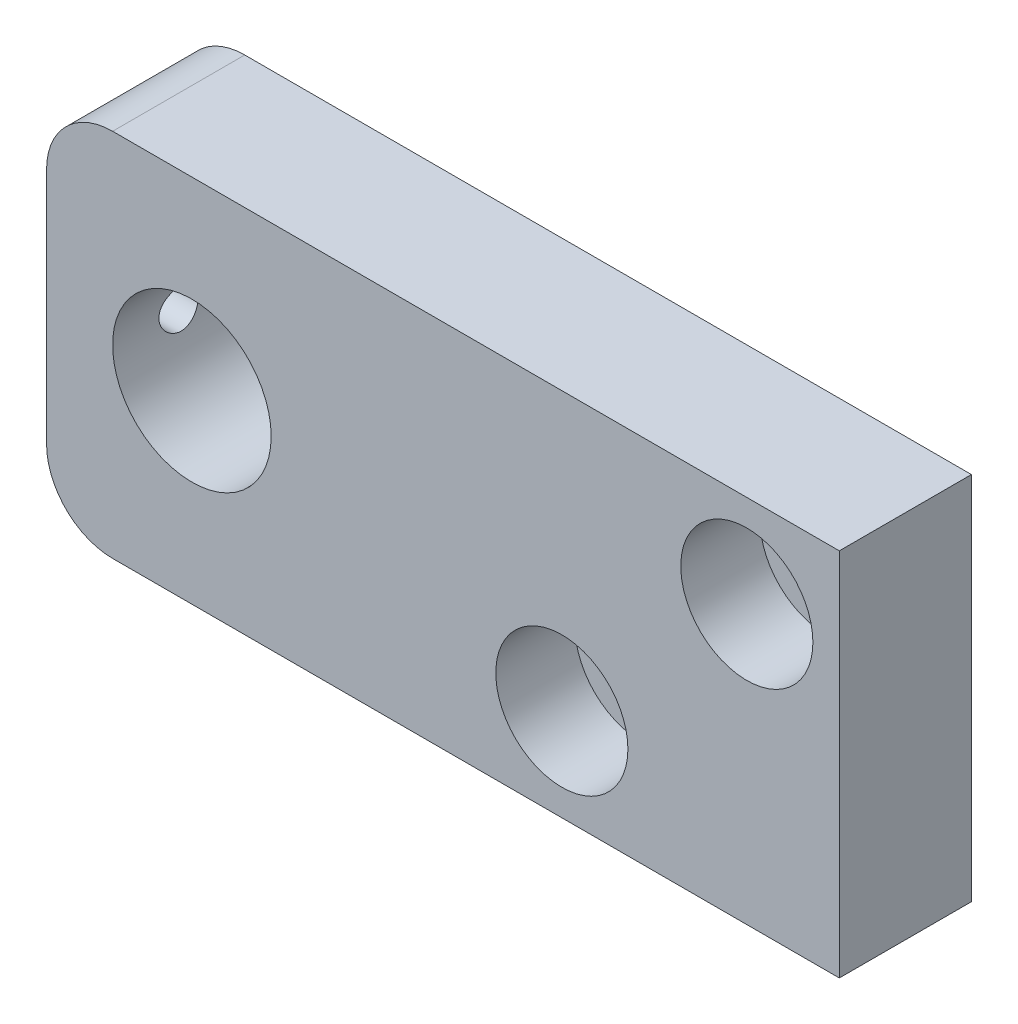
ISO-10303-21;
HEADER;
FILE_DESCRIPTION(('STEP AP214'),'2;1');
FILE_NAME('part.step','',(''),(''),'','','');
FILE_SCHEMA(('AUTOMOTIVE_DESIGN { 1 0 10303 214 1 1 1 1 }'));
ENDSEC;
DATA;
#1=APPLICATION_CONTEXT('core data for automotive mechanical design processes');
#2=APPLICATION_PROTOCOL_DEFINITION('international standard','automotive_design',2000,#1);
#3=PRODUCT_CONTEXT('',#1,'mechanical');
#4=PRODUCT('Part','Part','',(#3));
#5=PRODUCT_RELATED_PRODUCT_CATEGORY('part','',(#4));
#6=PRODUCT_DEFINITION_FORMATION('','',#4);
#7=PRODUCT_DEFINITION_CONTEXT('part definition',#1,'design');
#8=PRODUCT_DEFINITION('design','',#6,#7);
#9=PRODUCT_DEFINITION_SHAPE('','',#8);
#10=(LENGTH_UNIT() NAMED_UNIT(*) SI_UNIT(.MILLI.,.METRE.));
#11=(NAMED_UNIT(*) PLANE_ANGLE_UNIT() SI_UNIT($,.RADIAN.));
#12=(NAMED_UNIT(*) SI_UNIT($,.STERADIAN.) SOLID_ANGLE_UNIT());
#13=UNCERTAINTY_MEASURE_WITH_UNIT(LENGTH_MEASURE(1.E-05),#10,'distance_accuracy_value','');
#14=(GEOMETRIC_REPRESENTATION_CONTEXT(3) GLOBAL_UNCERTAINTY_ASSIGNED_CONTEXT((#13)) GLOBAL_UNIT_ASSIGNED_CONTEXT((#10,
#11,#12)) REPRESENTATION_CONTEXT('',''));
#15=CARTESIAN_POINT('',(0.,0.,0.));
#16=DIRECTION('',(0.,0.,1.));
#17=DIRECTION('',(1.,0.,0.));
#18=AXIS2_PLACEMENT_3D('',#15,#16,#17);
#19=CARTESIAN_POINT('',(23.,7.,10.));
#20=DIRECTION('',(0.,0.,-1.));
#21=DIRECTION('',(-1.,0.,0.));
#22=AXIS2_PLACEMENT_3D('',#19,#20,#21);
#23=CYLINDRICAL_SURFACE('',#22,3.);
#24=CARTESIAN_POINT('',(23.,7.,0.));
#25=DIRECTION('',(0.,0.,1.));
#26=DIRECTION('',(1.,0.,0.));
#27=AXIS2_PLACEMENT_3D('',#24,#25,#26);
#28=CIRCLE('',#27,3.);
#29=CARTESIAN_POINT('',(26.,7.,0.));
#30=VERTEX_POINT('',#29);
#31=EDGE_CURVE('E124',#30,#30,#28,.T.);
#32=ORIENTED_EDGE('',*,*,#31,.F.);
#33=EDGE_LOOP('',(#32));
#34=FACE_BOUND('',#33,.T.);
#35=CARTESIAN_POINT('',(23.,7.,4.));
#36=DIRECTION('',(0.,0.,1.));
#37=DIRECTION('',(1.,0.,0.));
#38=AXIS2_PLACEMENT_3D('',#35,#36,#37);
#39=CIRCLE('',#38,3.);
#40=CARTESIAN_POINT('',(26.,7.,4.));
#41=VERTEX_POINT('',#40);
#42=EDGE_CURVE('E37',#41,#41,#39,.T.);
#43=ORIENTED_EDGE('',*,*,#42,.T.);
#44=EDGE_LOOP('',(#43));
#45=FACE_BOUND('',#44,.T.);
#46=ADVANCED_FACE('F33',(#34,#45),#23,.F.);
#47=CARTESIAN_POINT('',(9.00000000000001,-7.,10.));
#48=DIRECTION('',(0.,0.,-1.));
#49=DIRECTION('',(-1.,0.,0.));
#50=AXIS2_PLACEMENT_3D('',#47,#48,#49);
#51=CYLINDRICAL_SURFACE('',#50,3.);
#52=CARTESIAN_POINT('',(9.00000000000001,-7.,0.));
#53=DIRECTION('',(0.,0.,1.));
#54=DIRECTION('',(1.,0.,0.));
#55=AXIS2_PLACEMENT_3D('',#52,#53,#54);
#56=CIRCLE('',#55,3.);
#57=CARTESIAN_POINT('',(12.,-7.,0.));
#58=VERTEX_POINT('',#57);
#59=EDGE_CURVE('E160',#58,#58,#56,.T.);
#60=ORIENTED_EDGE('',*,*,#59,.F.);
#61=EDGE_LOOP('',(#60));
#62=FACE_BOUND('',#61,.T.);
#63=CARTESIAN_POINT('',(9.00000000000001,-7.,4.));
#64=DIRECTION('',(0.,0.,1.));
#65=DIRECTION('',(1.,0.,0.));
#66=AXIS2_PLACEMENT_3D('',#63,#64,#65);
#67=CIRCLE('',#66,3.);
#68=CARTESIAN_POINT('',(12.,-7.,4.));
#69=VERTEX_POINT('',#68);
#70=EDGE_CURVE('E136',#69,#69,#67,.T.);
#71=ORIENTED_EDGE('',*,*,#70,.T.);
#72=EDGE_LOOP('',(#71));
#73=FACE_BOUND('',#72,.T.);
#74=ADVANCED_FACE('F191',(#62,#73),#51,.F.);
#75=CARTESIAN_POINT('',(-25.,9.,10.));
#76=DIRECTION('',(0.,0.,1.));
#77=DIRECTION('',(1.,0.,0.));
#78=AXIS2_PLACEMENT_3D('',#75,#76,#77);
#79=PLANE('',#78);
#80=CARTESIAN_POINT('',(9.00000000000001,-7.,10.));
#81=DIRECTION('',(0.,0.,1.));
#82=DIRECTION('',(1.,0.,0.));
#83=AXIS2_PLACEMENT_3D('',#80,#81,#82);
#84=CIRCLE('',#83,5.);
#85=CARTESIAN_POINT('',(14.,-7.,10.));
#86=VERTEX_POINT('',#85);
#87=EDGE_CURVE('E144',#86,#86,#84,.T.);
#88=ORIENTED_EDGE('',*,*,#87,.F.);
#89=EDGE_LOOP('',(#88));
#90=FACE_BOUND('',#89,.T.);
#91=CARTESIAN_POINT('',(23.,7.,10.));
#92=DIRECTION('',(0.,0.,1.));
#93=DIRECTION('',(1.,0.,0.));
#94=AXIS2_PLACEMENT_3D('',#91,#92,#93);
#95=CIRCLE('',#94,5.);
#96=CARTESIAN_POINT('',(28.,7.,10.));
#97=VERTEX_POINT('',#96);
#98=EDGE_CURVE('E154',#97,#97,#95,.T.);
#99=ORIENTED_EDGE('',*,*,#98,.F.);
#100=EDGE_LOOP('',(#99));
#101=FACE_BOUND('',#100,.T.);
#102=CARTESIAN_POINT('',(-19.,0.,10.));
#103=DIRECTION('',(0.,0.,1.));
#104=DIRECTION('',(1.,0.,0.));
#105=AXIS2_PLACEMENT_3D('',#102,#103,#104);
#106=CIRCLE('',#105,6.);
#107=CARTESIAN_POINT('',(-13.,0.,10.));
#108=VERTEX_POINT('',#107);
#109=EDGE_CURVE('E238',#108,#108,#106,.T.);
#110=ORIENTED_EDGE('',*,*,#109,.F.);
#111=EDGE_LOOP('',(#110));
#112=FACE_BOUND('',#111,.T.);
#113=DIRECTION('',(0.,1.,0.));
#114=VECTOR('',#113,1.);
#115=CARTESIAN_POINT('',(30.,-14.,10.));
#116=LINE('',#115,#114);
#117=CARTESIAN_POINT('',(30.,-14.,10.));
#118=VERTEX_POINT('',#117);
#119=CARTESIAN_POINT('',(30.,14.,10.));
#120=VERTEX_POINT('',#119);
#121=EDGE_CURVE('E131',#118,#120,#116,.T.);
#122=ORIENTED_EDGE('',*,*,#121,.T.);
#123=DIRECTION('',(-1.,0.,0.));
#124=VECTOR('',#123,1.);
#125=CARTESIAN_POINT('',(30.,14.,10.));
#126=LINE('',#125,#124);
#127=CARTESIAN_POINT('',(-25.,14.,10.));
#128=VERTEX_POINT('',#127);
#129=EDGE_CURVE('E89',#120,#128,#126,.T.);
#130=ORIENTED_EDGE('',*,*,#129,.T.);
#131=CARTESIAN_POINT('',(-25.,9.,10.));
#132=DIRECTION('',(0.,0.,1.));
#133=DIRECTION('',(1.,0.,0.));
#134=AXIS2_PLACEMENT_3D('',#131,#132,#133);
#135=CIRCLE('',#134,5.);
#136=CARTESIAN_POINT('',(-30.,9.,10.));
#137=VERTEX_POINT('',#136);
#138=EDGE_CURVE('E102',#128,#137,#135,.T.);
#139=ORIENTED_EDGE('',*,*,#138,.T.);
#140=DIRECTION('',(0.,-1.,0.));
#141=VECTOR('',#140,1.);
#142=CARTESIAN_POINT('',(-30.,-9.00000000000001,10.));
#143=LINE('',#142,#141);
#144=CARTESIAN_POINT('',(-30.,-9.00000000000001,10.));
#145=VERTEX_POINT('',#144);
#146=EDGE_CURVE('E96',#137,#145,#143,.T.);
#147=ORIENTED_EDGE('',*,*,#146,.T.);
#148=CARTESIAN_POINT('',(-25.,-9.00000000000001,10.));
#149=DIRECTION('',(0.,0.,1.));
#150=DIRECTION('',(-1.,0.,0.));
#151=AXIS2_PLACEMENT_3D('',#148,#149,#150);
#152=CIRCLE('',#151,5.);
#153=CARTESIAN_POINT('',(-25.,-14.,10.));
#154=VERTEX_POINT('',#153);
#155=EDGE_CURVE('E100',#145,#154,#152,.T.);
#156=ORIENTED_EDGE('',*,*,#155,.T.);
#157=DIRECTION('',(1.,0.,0.));
#158=VECTOR('',#157,1.);
#159=CARTESIAN_POINT('',(30.,-14.,10.));
#160=LINE('',#159,#158);
#161=EDGE_CURVE('E52',#154,#118,#160,.T.);
#162=ORIENTED_EDGE('',*,*,#161,.T.);
#163=EDGE_LOOP('',(#122,#130,#139,#147,#156,#162));
#164=FACE_BOUND('',#163,.T.);
#165=ADVANCED_FACE('F98',(#90,#101,#112,#164),#79,.T.);
#166=CARTESIAN_POINT('',(-25.,9.,0.));
#167=DIRECTION('',(0.,0.,1.));
#168=DIRECTION('',(1.,0.,0.));
#169=AXIS2_PLACEMENT_3D('',#166,#167,#168);
#170=PLANE('',#169);
#171=DIRECTION('',(0.,1.,0.));
#172=VECTOR('',#171,1.);
#173=CARTESIAN_POINT('',(30.,-14.,0.));
#174=LINE('',#173,#172);
#175=CARTESIAN_POINT('',(30.,-14.,0.));
#176=VERTEX_POINT('',#175);
#177=CARTESIAN_POINT('',(30.,14.,0.));
#178=VERTEX_POINT('',#177);
#179=EDGE_CURVE('E120',#176,#178,#174,.T.);
#180=ORIENTED_EDGE('',*,*,#179,.F.);
#181=DIRECTION('',(1.,0.,0.));
#182=VECTOR('',#181,1.);
#183=CARTESIAN_POINT('',(30.,-14.,0.));
#184=LINE('',#183,#182);
#185=CARTESIAN_POINT('',(-25.,-14.,0.));
#186=VERTEX_POINT('',#185);
#187=EDGE_CURVE('E81',#186,#176,#184,.T.);
#188=ORIENTED_EDGE('',*,*,#187,.F.);
#189=CARTESIAN_POINT('',(-25.,-9.00000000000001,0.));
#190=DIRECTION('',(0.,0.,1.));
#191=DIRECTION('',(-1.,0.,0.));
#192=AXIS2_PLACEMENT_3D('',#189,#190,#191);
#193=CIRCLE('',#192,5.);
#194=CARTESIAN_POINT('',(-30.,-9.00000000000001,0.));
#195=VERTEX_POINT('',#194);
#196=EDGE_CURVE('E75',#195,#186,#193,.T.);
#197=ORIENTED_EDGE('',*,*,#196,.F.);
#198=DIRECTION('',(0.,-1.,0.));
#199=VECTOR('',#198,1.);
#200=CARTESIAN_POINT('',(-30.,-9.00000000000001,0.));
#201=LINE('',#200,#199);
#202=CARTESIAN_POINT('',(-30.,9.,0.));
#203=VERTEX_POINT('',#202);
#204=EDGE_CURVE('E110',#203,#195,#201,.T.);
#205=ORIENTED_EDGE('',*,*,#204,.F.);
#206=CARTESIAN_POINT('',(-25.,9.,0.));
#207=DIRECTION('',(0.,0.,1.));
#208=DIRECTION('',(1.,0.,0.));
#209=AXIS2_PLACEMENT_3D('',#206,#207,#208);
#210=CIRCLE('',#209,5.);
#211=CARTESIAN_POINT('',(-25.,14.,0.));
#212=VERTEX_POINT('',#211);
#213=EDGE_CURVE('E126',#212,#203,#210,.T.);
#214=ORIENTED_EDGE('',*,*,#213,.F.);
#215=DIRECTION('',(-1.,0.,0.));
#216=VECTOR('',#215,1.);
#217=CARTESIAN_POINT('',(30.,14.,0.));
#218=LINE('',#217,#216);
#219=EDGE_CURVE('E123',#178,#212,#218,.T.);
#220=ORIENTED_EDGE('',*,*,#219,.F.);
#221=EDGE_LOOP('',(#180,#188,#197,#205,#214,#220));
#222=FACE_BOUND('',#221,.T.);
#223=ORIENTED_EDGE('',*,*,#31,.T.);
#224=EDGE_LOOP('',(#223));
#225=FACE_BOUND('',#224,.T.);
#226=CARTESIAN_POINT('',(-19.,0.,0.));
#227=DIRECTION('',(0.,0.,1.));
#228=DIRECTION('',(1.,0.,0.));
#229=AXIS2_PLACEMENT_3D('',#226,#227,#228);
#230=CIRCLE('',#229,6.);
#231=CARTESIAN_POINT('',(-13.,0.,0.));
#232=VERTEX_POINT('',#231);
#233=EDGE_CURVE('E239',#232,#232,#230,.T.);
#234=ORIENTED_EDGE('',*,*,#233,.T.);
#235=EDGE_LOOP('',(#234));
#236=FACE_BOUND('',#235,.T.);
#237=ORIENTED_EDGE('',*,*,#59,.T.);
#238=EDGE_LOOP('',(#237));
#239=FACE_BOUND('',#238,.T.);
#240=ADVANCED_FACE('F206',(#222,#225,#236,#239),#170,.F.);
#241=CARTESIAN_POINT('',(30.,-14.,10.));
#242=DIRECTION('',(-1.,0.,0.));
#243=DIRECTION('',(0.,0.,1.));
#244=AXIS2_PLACEMENT_3D('',#241,#242,#243);
#245=PLANE('',#244);
#246=ORIENTED_EDGE('',*,*,#179,.T.);
#247=DIRECTION('',(0.,0.,-1.));
#248=VECTOR('',#247,1.);
#249=CARTESIAN_POINT('',(30.,14.,10.));
#250=LINE('',#249,#248);
#251=EDGE_CURVE('E11',#120,#178,#250,.T.);
#252=ORIENTED_EDGE('',*,*,#251,.F.);
#253=ORIENTED_EDGE('',*,*,#121,.F.);
#254=DIRECTION('',(0.,0.,-1.));
#255=VECTOR('',#254,1.);
#256=CARTESIAN_POINT('',(30.,-14.,10.));
#257=LINE('',#256,#255);
#258=EDGE_CURVE('E116',#118,#176,#257,.T.);
#259=ORIENTED_EDGE('',*,*,#258,.T.);
#260=EDGE_LOOP('',(#246,#252,#253,#259));
#261=FACE_BOUND('',#260,.T.);
#262=ADVANCED_FACE('F35',(#261),#245,.F.);
#263=CARTESIAN_POINT('',(30.,14.,10.));
#264=DIRECTION('',(0.,-1.,0.));
#265=DIRECTION('',(1.,0.,0.));
#266=AXIS2_PLACEMENT_3D('',#263,#264,#265);
#267=PLANE('',#266);
#268=ORIENTED_EDGE('',*,*,#219,.T.);
#269=DIRECTION('',(0.,0.,-1.));
#270=VECTOR('',#269,1.);
#271=CARTESIAN_POINT('',(-25.,14.,10.));
#272=LINE('',#271,#270);
#273=EDGE_CURVE('E43',#128,#212,#272,.T.);
#274=ORIENTED_EDGE('',*,*,#273,.F.);
#275=ORIENTED_EDGE('',*,*,#129,.F.);
#276=ORIENTED_EDGE('',*,*,#251,.T.);
#277=EDGE_LOOP('',(#268,#274,#275,#276));
#278=FACE_BOUND('',#277,.T.);
#279=ADVANCED_FACE('F221',(#278),#267,.F.);
#280=CARTESIAN_POINT('',(-25.,9.,10.));
#281=DIRECTION('',(0.,0.,-1.));
#282=DIRECTION('',(-1.,0.,0.));
#283=AXIS2_PLACEMENT_3D('',#280,#281,#282);
#284=CYLINDRICAL_SURFACE('',#283,5.);
#285=ORIENTED_EDGE('',*,*,#213,.T.);
#286=DIRECTION('',(0.,0.,-1.));
#287=VECTOR('',#286,1.);
#288=CARTESIAN_POINT('',(-30.,9.,10.));
#289=LINE('',#288,#287);
#290=EDGE_CURVE('E111',#137,#203,#289,.T.);
#291=ORIENTED_EDGE('',*,*,#290,.F.);
#292=ORIENTED_EDGE('',*,*,#138,.F.);
#293=ORIENTED_EDGE('',*,*,#273,.T.);
#294=EDGE_LOOP('',(#285,#291,#292,#293));
#295=FACE_BOUND('',#294,.T.);
#296=ADVANCED_FACE('F218',(#295),#284,.T.);
#297=CARTESIAN_POINT('',(-30.,-9.00000000000001,10.));
#298=DIRECTION('',(1.,0.,0.));
#299=DIRECTION('',(0.,0.,-1.));
#300=AXIS2_PLACEMENT_3D('',#297,#298,#299);
#301=PLANE('',#300);
#302=CARTESIAN_POINT('',(-30.,0.,5.));
#303=DIRECTION('',(-1.,0.,0.));
#304=DIRECTION('',(0.,0.,1.));
#305=AXIS2_PLACEMENT_3D('',#302,#303,#304);
#306=CIRCLE('',#305,1.5);
#307=CARTESIAN_POINT('',(-30.,0.,6.5));
#308=VERTEX_POINT('',#307);
#309=EDGE_CURVE('E157',#308,#308,#306,.T.);
#310=ORIENTED_EDGE('',*,*,#309,.F.);
#311=EDGE_LOOP('',(#310));
#312=FACE_BOUND('',#311,.T.);
#313=ORIENTED_EDGE('',*,*,#204,.T.);
#314=DIRECTION('',(0.,0.,-1.));
#315=VECTOR('',#314,1.);
#316=CARTESIAN_POINT('',(-30.,-9.00000000000001,10.));
#317=LINE('',#316,#315);
#318=EDGE_CURVE('E107',#145,#195,#317,.T.);
#319=ORIENTED_EDGE('',*,*,#318,.F.);
#320=ORIENTED_EDGE('',*,*,#146,.F.);
#321=ORIENTED_EDGE('',*,*,#290,.T.);
#322=EDGE_LOOP('',(#313,#319,#320,#321));
#323=FACE_BOUND('',#322,.T.);
#324=ADVANCED_FACE('F108',(#312,#323),#301,.F.);
#325=CARTESIAN_POINT('',(-25.,-9.00000000000001,10.));
#326=DIRECTION('',(0.,0.,-1.));
#327=DIRECTION('',(-1.,0.,0.));
#328=AXIS2_PLACEMENT_3D('',#325,#326,#327);
#329=CYLINDRICAL_SURFACE('',#328,5.);
#330=ORIENTED_EDGE('',*,*,#196,.T.);
#331=DIRECTION('',(0.,0.,-1.));
#332=VECTOR('',#331,1.);
#333=CARTESIAN_POINT('',(-25.,-14.,10.));
#334=LINE('',#333,#332);
#335=EDGE_CURVE('E112',#154,#186,#334,.T.);
#336=ORIENTED_EDGE('',*,*,#335,.F.);
#337=ORIENTED_EDGE('',*,*,#155,.F.);
#338=ORIENTED_EDGE('',*,*,#318,.T.);
#339=EDGE_LOOP('',(#330,#336,#337,#338));
#340=FACE_BOUND('',#339,.T.);
#341=ADVANCED_FACE('F114',(#340),#329,.T.);
#342=CARTESIAN_POINT('',(30.,-14.,10.));
#343=DIRECTION('',(0.,1.,0.));
#344=DIRECTION('',(-1.,0.,0.));
#345=AXIS2_PLACEMENT_3D('',#342,#343,#344);
#346=PLANE('',#345);
#347=ORIENTED_EDGE('',*,*,#187,.T.);
#348=ORIENTED_EDGE('',*,*,#258,.F.);
#349=ORIENTED_EDGE('',*,*,#161,.F.);
#350=ORIENTED_EDGE('',*,*,#335,.T.);
#351=EDGE_LOOP('',(#347,#348,#349,#350));
#352=FACE_BOUND('',#351,.T.);
#353=ADVANCED_FACE('F211',(#352),#346,.F.);
#354=CARTESIAN_POINT('',(-19.,0.,10.));
#355=DIRECTION('',(0.,0.,-1.));
#356=DIRECTION('',(-1.,0.,0.));
#357=AXIS2_PLACEMENT_3D('',#354,#355,#356);
#358=CYLINDRICAL_SURFACE('',#357,6.);
#359=CARTESIAN_POINT('',(-25.,0.,6.5));
#360=CARTESIAN_POINT('',(-24.9999985986801,0.082876088669731,6.49999767426184));
#361=CARTESIAN_POINT('',(-24.9982657813183,0.165778157830763,6.49310844922621));
#362=CARTESIAN_POINT('',(-24.9915211382989,0.329206323770532,6.465774848693));
#363=CARTESIAN_POINT('',(-24.9865074541997,0.409731046870739,6.44532279046215));
#364=CARTESIAN_POINT('',(-24.9737562633204,0.566020872182577,6.39156074653791));
#365=CARTESIAN_POINT('',(-24.9660220284209,0.641791563430003,6.35826620128472));
#366=CARTESIAN_POINT('',(-24.9486534380759,0.786672131904426,6.27981860995517));
#367=CARTESIAN_POINT('',(-24.9390190185405,0.855781784348759,6.23466516388106));
#368=CARTESIAN_POINT('',(-24.918674135918,0.986801927300919,6.13279921034579));
#369=CARTESIAN_POINT('',(-24.9079470714853,1.04855569006107,6.07588842504082));
#370=CARTESIAN_POINT('',(-24.8867362011753,1.1617489272033,5.95254779509108));
#371=CARTESIAN_POINT('',(-24.8762524228835,1.21318723694913,5.8861168770535));
#372=CARTESIAN_POINT('',(-24.8565477569971,1.30502654279903,5.74440477326256));
#373=CARTESIAN_POINT('',(-24.8473479447061,1.34525221592536,5.6690067691896));
#374=CARTESIAN_POINT('',(-24.8314949481222,1.41239690855053,5.51225158834164));
#375=CARTESIAN_POINT('',(-24.8248413567279,1.43931805543933,5.43089536667424));
#376=CARTESIAN_POINT('',(-24.8150047671755,1.47855483680429,5.26625650179753));
#377=CARTESIAN_POINT('',(-24.8117549107543,1.49115226833334,5.1830451039502));
#378=CARTESIAN_POINT('',(-24.8088936253774,1.50226177506785,5.01563143098602));
#379=CARTESIAN_POINT('',(-24.8092816044864,1.50077614181798,4.93142931930139));
#380=CARTESIAN_POINT('',(-24.8135920549662,1.48398652463928,4.76658419225552));
#381=CARTESIAN_POINT('',(-24.8174286300188,1.46901834019052,4.6859043785349));
#382=CARTESIAN_POINT('',(-24.8280670967648,1.42622418690311,4.52823894908871));
#383=CARTESIAN_POINT('',(-24.834869199707,1.39839730206942,4.45125359697102));
#384=CARTESIAN_POINT('',(-24.8507511390419,1.33038947793715,4.30226198374793));
#385=CARTESIAN_POINT('',(-24.8598532746942,1.29008666723291,4.23031382821045));
#386=CARTESIAN_POINT('',(-24.8792971084639,1.19835627601496,4.09408129024316));
#387=CARTESIAN_POINT('',(-24.8896390233473,1.14692674880884,4.02979825193274));
#388=CARTESIAN_POINT('',(-24.9107588053978,1.03266342468122,3.9087963843056));
#389=CARTESIAN_POINT('',(-24.9215406947797,0.969546258165861,3.85234550993865));
#390=CARTESIAN_POINT('',(-24.9420596557879,0.834611917503701,3.7507787575361));
#391=CARTESIAN_POINT('',(-24.9517966954941,0.762794477707945,3.70566322573643));
#392=CARTESIAN_POINT('',(-24.9691773209418,0.612115888681393,3.62794941377561));
#393=CARTESIAN_POINT('',(-24.9768136012772,0.533231393208624,3.59539465974557));
#394=CARTESIAN_POINT('',(-24.9890791699142,0.370876008142884,3.54408269429043));
#395=CARTESIAN_POINT('',(-24.9937090333928,0.287405999150486,3.52532284358186));
#396=CARTESIAN_POINT('',(-24.9993549927137,0.120539970390028,3.50254243444116));
#397=CARTESIAN_POINT('',(-25.0004605350828,0.0371967199882106,3.4981569739247));
#398=CARTESIAN_POINT('',(-24.9991880481445,-0.129032874801507,3.50324900205549));
#399=CARTESIAN_POINT('',(-24.9968103324185,-0.211919259644594,3.51272524279913));
#400=CARTESIAN_POINT('',(-24.9888958112736,-0.373614268776491,3.54497090839138));
#401=CARTESIAN_POINT('',(-24.9834063418581,-0.452465118968754,3.56754126347699));
#402=CARTESIAN_POINT('',(-24.9698870663413,-0.605257292452511,3.62510708402845));
#403=CARTESIAN_POINT('',(-24.9618570036989,-0.679198119032634,3.66010380431317));
#404=CARTESIAN_POINT('',(-24.9439330792631,-0.821523134429847,3.74223612887473));
#405=CARTESIAN_POINT('',(-24.9340086736693,-0.88978544183583,3.78957611239676));
#406=CARTESIAN_POINT('',(-24.9134450918742,-1.01752661364325,3.89478990879697));
#407=CARTESIAN_POINT('',(-24.902805792517,-1.07700395897301,3.95266553961691));
#408=CARTESIAN_POINT('',(-24.8816895696077,-1.18699056807273,4.07900196084446));
#409=CARTESIAN_POINT('',(-24.8712230418728,-1.23724386762203,4.14768770300242));
#410=CARTESIAN_POINT('',(-24.8519287837724,-1.3255107590127,4.29273263446572));
#411=CARTESIAN_POINT('',(-24.8431009806703,-1.36352489415794,4.36909148295975));
#412=CARTESIAN_POINT('',(-24.8281809473466,-1.42595142060929,4.52690572241308));
#413=CARTESIAN_POINT('',(-24.8220725529191,-1.45044439665407,4.60832762834401));
#414=CARTESIAN_POINT('',(-24.8132674409018,-1.48534565995378,4.77430963788911));
#415=CARTESIAN_POINT('',(-24.8105699771994,-1.49575702747866,4.85886905103249));
#416=CARTESIAN_POINT('',(-24.8089490120396,-1.502038590334,5.0261210238552));
#417=CARTESIAN_POINT('',(-24.8099193272826,-1.49831789778012,5.10879743512473));
#418=CARTESIAN_POINT('',(-24.8152790900784,-1.47737727831287,5.27230388866798));
#419=CARTESIAN_POINT('',(-24.8196684689186,-1.46015762268677,5.35313396801365));
#420=CARTESIAN_POINT('',(-24.8313126068272,-1.41293131944279,5.51020845906541));
#421=CARTESIAN_POINT('',(-24.8385501523631,-1.38300140468038,5.58647730524021));
#422=CARTESIAN_POINT('',(-24.8550775572483,-1.31126491360507,5.73296538271369));
#423=CARTESIAN_POINT('',(-24.8643677012077,-1.26945669003419,5.80318377318692));
#424=CARTESIAN_POINT('',(-24.8842563426351,-1.17386774863714,5.93755462900202));
#425=CARTESIAN_POINT('',(-24.8948826483176,-1.11980316291226,6.00150107342396));
#426=CARTESIAN_POINT('',(-24.9160802724629,-1.00178937118974,6.11954704479541));
#427=CARTESIAN_POINT('',(-24.9266515772706,-0.937837821261146,6.17364423011297));
#428=CARTESIAN_POINT('',(-24.9467765564766,-0.800467586702591,6.27141130856461));
#429=CARTESIAN_POINT('',(-24.9563083336587,-0.726898422316387,6.31487461367158));
#430=CARTESIAN_POINT('',(-24.9730492497512,-0.573266059510477,6.38874746294053));
#431=CARTESIAN_POINT('',(-24.9802600519978,-0.49320756343674,6.41916636064854));
#432=CARTESIAN_POINT('',(-24.9904805956554,-0.344410253243472,6.46157183032965));
#433=CARTESIAN_POINT('',(-24.9940258505269,-0.276380170908068,6.47595124305343));
#434=CARTESIAN_POINT('',(-24.9987860523195,-0.138906071536283,6.49516594362194));
#435=CARTESIAN_POINT('',(-25.0000011745089,-0.069462161242616,6.5000019493053));
#436=CARTESIAN_POINT('',(-25.,0.,6.5));
#437=B_SPLINE_CURVE_WITH_KNOTS('',3,(#359,#360,#361,#362,#363,#364,#365,#366,#367,#368,#369,
#370,#371,#372,#373,#374,#375,#376,#377,#378,#379,#380,#381,#382,#383,#384,#385,#386,#387,#388,
#389,#390,#391,#392,#393,#394,#395,#396,#397,#398,#399,#400,#401,#402,#403,#404,#405,#406,#407,
#408,#409,#410,#411,#412,#413,#414,#415,#416,#417,#418,#419,#420,#421,#422,#423,#424,#425,#426,
#427,#428,#429,#430,#431,#432,#433,#434,#435,#436),.UNSPECIFIED.,.T.,.F.,(4,2,2,2,2,2,2,2,2,2,2,
2,2,2,2,2,2,2,2,2,2,2,2,2,2,2,2,2,2,2,2,2,2,2,2,2,2,2,4),(0.,0.24837371247189,0.4968882377639,
0.745104902286106,0.993329940169328,1.24614435437139,1.49898729580062,1.75558647545807,
2.01214461169368,2.2635629509943,2.51494038112697,2.76022497007018,3.00552703466038,
3.25330527873879,3.50112690836163,3.75601500969019,4.01091089558247,4.26668229009114,
4.52240473688643,4.77158308949276,5.02073901112743,5.26620274514037,5.5116912732229,
5.76153587565352,6.01142363008019,6.26744509204476,6.52345518749508,6.77792254614036,
7.03233423252408,7.27943780398613,7.52653640956034,7.77216400559447,8.01782568136901,
8.2698957640991,8.52202569770418,8.77872185499588,9.0352336382135,9.24342242942149,
9.4515955604304),.UNSPECIFIED.);
#438=CARTESIAN_POINT('',(-25.,0.,6.5));
#439=VERTEX_POINT('',#438);
#440=EDGE_CURVE('E142',#439,#439,#437,.T.);
#441=ORIENTED_EDGE('',*,*,#440,.T.);
#442=EDGE_LOOP('',(#441));
#443=FACE_BOUND('',#442,.T.);
#444=ORIENTED_EDGE('',*,*,#109,.T.);
#445=EDGE_LOOP('',(#444));
#446=FACE_BOUND('',#445,.T.);
#447=ORIENTED_EDGE('',*,*,#233,.F.);
#448=EDGE_LOOP('',(#447));
#449=FACE_BOUND('',#448,.T.);
#450=ADVANCED_FACE('F203',(#443,#446,#449),#358,.F.);
#451=CARTESIAN_POINT('',(30.001,0.,5.));
#452=DIRECTION('',(-1.,0.,0.));
#453=DIRECTION('',(0.,0.,1.));
#454=AXIS2_PLACEMENT_3D('',#451,#452,#453);
#455=CYLINDRICAL_SURFACE('',#454,1.5);
#456=ORIENTED_EDGE('',*,*,#440,.F.);
#457=EDGE_LOOP('',(#456));
#458=FACE_BOUND('',#457,.T.);
#459=ORIENTED_EDGE('',*,*,#309,.T.);
#460=EDGE_LOOP('',(#459));
#461=FACE_BOUND('',#460,.T.);
#462=ADVANCED_FACE('F168',(#458,#461),#455,.F.);
#463=CARTESIAN_POINT('',(9.00000000000001,-7.,4.));
#464=DIRECTION('',(0.,0.,1.));
#465=DIRECTION('',(1.,0.,0.));
#466=AXIS2_PLACEMENT_3D('',#463,#464,#465);
#467=CYLINDRICAL_SURFACE('',#466,5.);
#468=CARTESIAN_POINT('',(9.00000000000001,-7.,4.));
#469=DIRECTION('',(0.,0.,1.));
#470=DIRECTION('',(1.,0.,0.));
#471=AXIS2_PLACEMENT_3D('',#468,#469,#470);
#472=CIRCLE('',#471,5.);
#473=CARTESIAN_POINT('',(14.,-7.,4.));
#474=VERTEX_POINT('',#473);
#475=EDGE_CURVE('E138',#474,#474,#472,.T.);
#476=ORIENTED_EDGE('',*,*,#475,.F.);
#477=EDGE_LOOP('',(#476));
#478=FACE_BOUND('',#477,.T.);
#479=ORIENTED_EDGE('',*,*,#87,.T.);
#480=EDGE_LOOP('',(#479));
#481=FACE_BOUND('',#480,.T.);
#482=ADVANCED_FACE('F182',(#478,#481),#467,.F.);
#483=CARTESIAN_POINT('',(9.00000000000001,-7.,4.));
#484=DIRECTION('',(0.,0.,1.));
#485=DIRECTION('',(1.,0.,0.));
#486=AXIS2_PLACEMENT_3D('',#483,#484,#485);
#487=PLANE('',#486);
#488=ORIENTED_EDGE('',*,*,#70,.F.);
#489=EDGE_LOOP('',(#488));
#490=FACE_BOUND('',#489,.T.);
#491=ORIENTED_EDGE('',*,*,#475,.T.);
#492=EDGE_LOOP('',(#491));
#493=FACE_BOUND('',#492,.T.);
#494=ADVANCED_FACE('F177',(#490,#493),#487,.T.);
#495=CARTESIAN_POINT('',(23.,7.,4.));
#496=DIRECTION('',(0.,0.,1.));
#497=DIRECTION('',(1.,0.,0.));
#498=AXIS2_PLACEMENT_3D('',#495,#496,#497);
#499=CYLINDRICAL_SURFACE('',#498,5.);
#500=CARTESIAN_POINT('',(23.,7.,4.));
#501=DIRECTION('',(0.,0.,1.));
#502=DIRECTION('',(1.,0.,0.));
#503=AXIS2_PLACEMENT_3D('',#500,#501,#502);
#504=CIRCLE('',#503,5.);
#505=CARTESIAN_POINT('',(28.,7.,4.));
#506=VERTEX_POINT('',#505);
#507=EDGE_CURVE('E149',#506,#506,#504,.T.);
#508=ORIENTED_EDGE('',*,*,#507,.F.);
#509=EDGE_LOOP('',(#508));
#510=FACE_BOUND('',#509,.T.);
#511=ORIENTED_EDGE('',*,*,#98,.T.);
#512=EDGE_LOOP('',(#511));
#513=FACE_BOUND('',#512,.T.);
#514=ADVANCED_FACE('F173',(#510,#513),#499,.F.);
#515=CARTESIAN_POINT('',(23.,7.,4.));
#516=DIRECTION('',(0.,0.,1.));
#517=DIRECTION('',(1.,0.,0.));
#518=AXIS2_PLACEMENT_3D('',#515,#516,#517);
#519=PLANE('',#518);
#520=ORIENTED_EDGE('',*,*,#42,.F.);
#521=EDGE_LOOP('',(#520));
#522=FACE_BOUND('',#521,.T.);
#523=ORIENTED_EDGE('',*,*,#507,.T.);
#524=EDGE_LOOP('',(#523));
#525=FACE_BOUND('',#524,.T.);
#526=ADVANCED_FACE('F176',(#522,#525),#519,.T.);
#527=CLOSED_SHELL('',(#46,#74,#165,#240,#262,#279,#296,#324,#341,#353,#450,#462,#482,#494,#514,#526));
#528=MANIFOLD_SOLID_BREP('B2',#527);
#529=ADVANCED_BREP_SHAPE_REPRESENTATION('',(#18,#528),#14);
#530=SHAPE_DEFINITION_REPRESENTATION(#9,#529);
ENDSEC;
END-ISO-10303-21;
